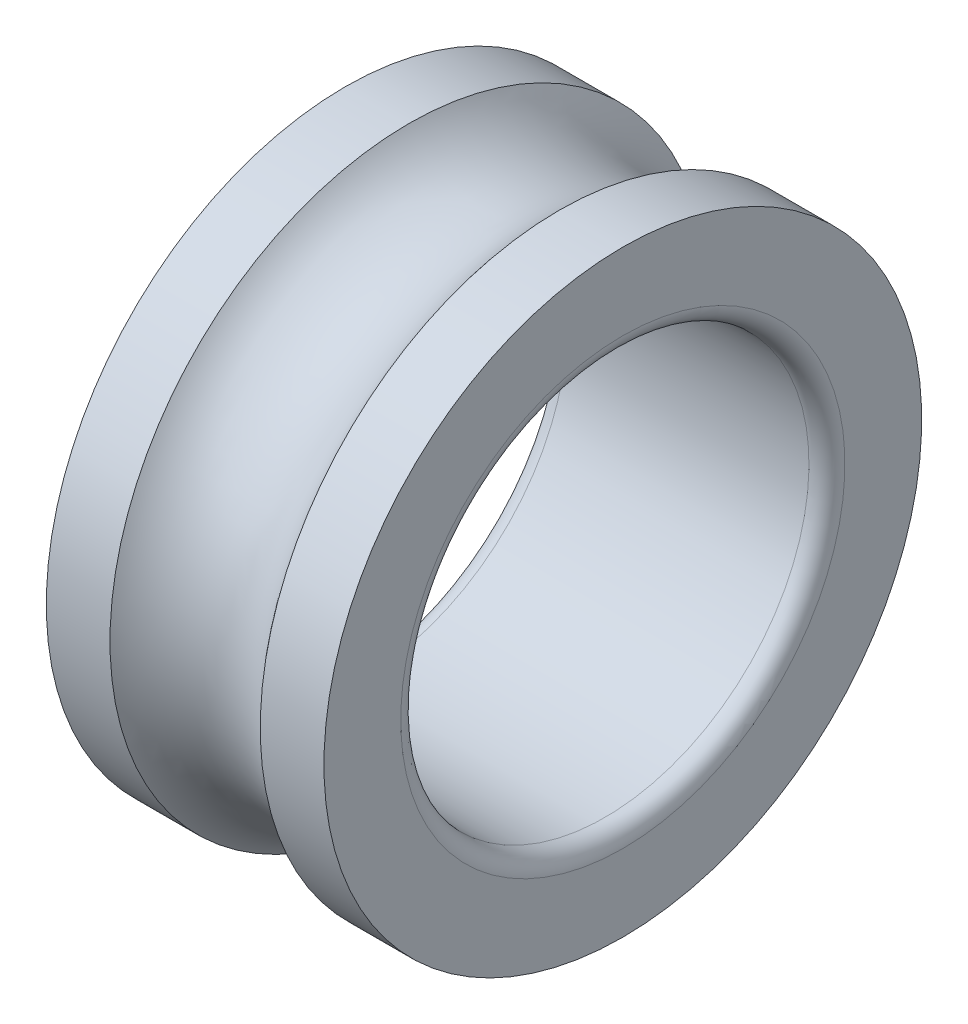
ISO-10303-21;
HEADER;
FILE_DESCRIPTION(('STEP AP214'),'2;1');
FILE_NAME('part.step','',(''),(''),'','','');
FILE_SCHEMA(('AUTOMOTIVE_DESIGN { 1 0 10303 214 1 1 1 1 }'));
ENDSEC;
DATA;
#1=APPLICATION_CONTEXT('core data for automotive mechanical design processes');
#2=APPLICATION_PROTOCOL_DEFINITION('international standard','automotive_design',2000,#1);
#3=PRODUCT_CONTEXT('',#1,'mechanical');
#4=PRODUCT('Part','Part','',(#3));
#5=PRODUCT_RELATED_PRODUCT_CATEGORY('part','',(#4));
#6=PRODUCT_DEFINITION_FORMATION('','',#4);
#7=PRODUCT_DEFINITION_CONTEXT('part definition',#1,'design');
#8=PRODUCT_DEFINITION('design','',#6,#7);
#9=PRODUCT_DEFINITION_SHAPE('','',#8);
#10=(LENGTH_UNIT() NAMED_UNIT(*) SI_UNIT(.MILLI.,.METRE.));
#11=(NAMED_UNIT(*) PLANE_ANGLE_UNIT() SI_UNIT($,.RADIAN.));
#12=(NAMED_UNIT(*) SI_UNIT($,.STERADIAN.) SOLID_ANGLE_UNIT());
#13=UNCERTAINTY_MEASURE_WITH_UNIT(LENGTH_MEASURE(1.E-05),#10,'distance_accuracy_value','');
#14=(GEOMETRIC_REPRESENTATION_CONTEXT(3) GLOBAL_UNCERTAINTY_ASSIGNED_CONTEXT((#13)) GLOBAL_UNIT_ASSIGNED_CONTEXT((#10,
#11,#12)) REPRESENTATION_CONTEXT('',''));
#15=CARTESIAN_POINT('',(0.,0.,0.));
#16=DIRECTION('',(0.,0.,1.));
#17=DIRECTION('',(1.,0.,0.));
#18=AXIS2_PLACEMENT_3D('',#15,#16,#17);
#19=CARTESIAN_POINT('',(15.05,0.,0.));
#20=DIRECTION('',(-1.,0.,0.));
#21=DIRECTION('',(0.,1.,0.));
#22=AXIS2_PLACEMENT_3D('',#19,#20,#21);
#23=CYLINDRICAL_SURFACE('',#22,18.3);
#24=CARTESIAN_POINT('',(13.1,0.,0.));
#25=DIRECTION('',(1.,0.,0.));
#26=DIRECTION('',(0.,1.,0.));
#27=AXIS2_PLACEMENT_3D('',#24,#25,#26);
#28=CIRCLE('',#27,18.3);
#29=CARTESIAN_POINT('',(13.1,18.3,0.));
#30=VERTEX_POINT('',#29);
#31=EDGE_CURVE('E11',#30,#30,#28,.T.);
#32=ORIENTED_EDGE('',*,*,#31,.T.);
#33=EDGE_LOOP('',(#32));
#34=FACE_BOUND('',#33,.T.);
#35=CARTESIAN_POINT('',(17.,0.,0.));
#36=DIRECTION('',(1.,0.,0.));
#37=DIRECTION('',(0.,1.,0.));
#38=AXIS2_PLACEMENT_3D('',#35,#36,#37);
#39=CIRCLE('',#38,18.3);
#40=CARTESIAN_POINT('',(17.,18.3,0.));
#41=VERTEX_POINT('',#40);
#42=EDGE_CURVE('E60',#41,#41,#39,.T.);
#43=ORIENTED_EDGE('',*,*,#42,.F.);
#44=EDGE_LOOP('',(#43));
#45=FACE_BOUND('',#44,.T.);
#46=ADVANCED_FACE('F17',(#34,#45),#23,.T.);
#47=CARTESIAN_POINT('',(8.5,0.,0.));
#48=DIRECTION('',(1.,0.,0.));
#49=DIRECTION('',(0.,0.,-1.));
#50=AXIS2_PLACEMENT_3D('',#47,#48,#49);
#51=TOROIDAL_SURFACE('',#50,21.75,5.75);
#52=CARTESIAN_POINT('',(3.9,0.,0.));
#53=DIRECTION('',(1.,0.,0.));
#54=DIRECTION('',(0.,1.,0.));
#55=AXIS2_PLACEMENT_3D('',#52,#53,#54);
#56=CIRCLE('',#55,18.3);
#57=CARTESIAN_POINT('',(3.9,18.3,0.));
#58=VERTEX_POINT('',#57);
#59=EDGE_CURVE('E28',#58,#58,#56,.T.);
#60=ORIENTED_EDGE('',*,*,#59,.T.);
#61=EDGE_LOOP('',(#60));
#62=FACE_BOUND('',#61,.T.);
#63=ORIENTED_EDGE('',*,*,#31,.F.);
#64=EDGE_LOOP('',(#63));
#65=FACE_BOUND('',#64,.T.);
#66=ADVANCED_FACE('F109',(#62,#65),#51,.F.);
#67=CARTESIAN_POINT('',(1.95,0.,0.));
#68=DIRECTION('',(-1.,0.,0.));
#69=DIRECTION('',(0.,1.,0.));
#70=AXIS2_PLACEMENT_3D('',#67,#68,#69);
#71=CYLINDRICAL_SURFACE('',#70,18.3);
#72=CARTESIAN_POINT('',(0.,0.,0.));
#73=DIRECTION('',(1.,0.,0.));
#74=DIRECTION('',(0.,1.,0.));
#75=AXIS2_PLACEMENT_3D('',#72,#73,#74);
#76=CIRCLE('',#75,18.3);
#77=CARTESIAN_POINT('',(0.,18.3,0.));
#78=VERTEX_POINT('',#77);
#79=EDGE_CURVE('E71',#78,#78,#76,.T.);
#80=ORIENTED_EDGE('',*,*,#79,.T.);
#81=EDGE_LOOP('',(#80));
#82=FACE_BOUND('',#81,.T.);
#83=ORIENTED_EDGE('',*,*,#59,.F.);
#84=EDGE_LOOP('',(#83));
#85=FACE_BOUND('',#84,.T.);
#86=ADVANCED_FACE('F72',(#82,#85),#71,.T.);
#87=CARTESIAN_POINT('',(0.,15.95,0.));
#88=DIRECTION('',(-1.,0.,0.));
#89=DIRECTION('',(0.,-1.,0.));
#90=AXIS2_PLACEMENT_3D('',#87,#88,#89);
#91=PLANE('',#90);
#92=CARTESIAN_POINT('',(0.,0.,0.));
#93=DIRECTION('',(1.,0.,0.));
#94=DIRECTION('',(0.,1.,0.));
#95=AXIS2_PLACEMENT_3D('',#92,#93,#94);
#96=CIRCLE('',#95,13.6);
#97=CARTESIAN_POINT('',(0.,13.6,0.));
#98=VERTEX_POINT('',#97);
#99=EDGE_CURVE('E21',#98,#98,#96,.T.);
#100=ORIENTED_EDGE('',*,*,#99,.T.);
#101=EDGE_LOOP('',(#100));
#102=FACE_BOUND('',#101,.T.);
#103=ORIENTED_EDGE('',*,*,#79,.F.);
#104=EDGE_LOOP('',(#103));
#105=FACE_BOUND('',#104,.T.);
#106=ADVANCED_FACE('F106',(#102,#105),#91,.T.);
#107=CARTESIAN_POINT('',(1.1,0.,0.));
#108=DIRECTION('',(1.,0.,0.));
#109=DIRECTION('',(0.,0.,-1.));
#110=AXIS2_PLACEMENT_3D('',#107,#108,#109);
#111=TOROIDAL_SURFACE('',#110,13.6,1.1);
#112=CARTESIAN_POINT('',(1.1,0.,0.));
#113=DIRECTION('',(1.,0.,0.));
#114=DIRECTION('',(0.,1.,0.));
#115=AXIS2_PLACEMENT_3D('',#112,#113,#114);
#116=CIRCLE('',#115,12.5);
#117=CARTESIAN_POINT('',(1.1,12.5,0.));
#118=VERTEX_POINT('',#117);
#119=EDGE_CURVE('E81',#118,#118,#116,.T.);
#120=ORIENTED_EDGE('',*,*,#119,.T.);
#121=EDGE_LOOP('',(#120));
#122=FACE_BOUND('',#121,.T.);
#123=ORIENTED_EDGE('',*,*,#99,.F.);
#124=EDGE_LOOP('',(#123));
#125=FACE_BOUND('',#124,.T.);
#126=ADVANCED_FACE('F93',(#122,#125),#111,.T.);
#127=CARTESIAN_POINT('',(8.5,0.,0.));
#128=DIRECTION('',(-1.,0.,0.));
#129=DIRECTION('',(0.,1.,0.));
#130=AXIS2_PLACEMENT_3D('',#127,#128,#129);
#131=CYLINDRICAL_SURFACE('',#130,12.5);
#132=CARTESIAN_POINT('',(15.9,0.,0.));
#133=DIRECTION('',(1.,0.,0.));
#134=DIRECTION('',(0.,1.,0.));
#135=AXIS2_PLACEMENT_3D('',#132,#133,#134);
#136=CIRCLE('',#135,12.5);
#137=CARTESIAN_POINT('',(15.9,12.5,0.));
#138=VERTEX_POINT('',#137);
#139=EDGE_CURVE('E65',#138,#138,#136,.T.);
#140=ORIENTED_EDGE('',*,*,#139,.T.);
#141=EDGE_LOOP('',(#140));
#142=FACE_BOUND('',#141,.T.);
#143=ORIENTED_EDGE('',*,*,#119,.F.);
#144=EDGE_LOOP('',(#143));
#145=FACE_BOUND('',#144,.T.);
#146=ADVANCED_FACE('F96',(#142,#145),#131,.F.);
#147=CARTESIAN_POINT('',(15.9,0.,0.));
#148=DIRECTION('',(1.,0.,0.));
#149=DIRECTION('',(0.,0.,-1.));
#150=AXIS2_PLACEMENT_3D('',#147,#148,#149);
#151=TOROIDAL_SURFACE('',#150,13.6,1.1);
#152=CARTESIAN_POINT('',(17.,0.,0.));
#153=DIRECTION('',(1.,0.,0.));
#154=DIRECTION('',(0.,1.,0.));
#155=AXIS2_PLACEMENT_3D('',#152,#153,#154);
#156=CIRCLE('',#155,13.6);
#157=CARTESIAN_POINT('',(17.,13.6,0.));
#158=VERTEX_POINT('',#157);
#159=EDGE_CURVE('E55',#158,#158,#156,.T.);
#160=ORIENTED_EDGE('',*,*,#159,.T.);
#161=EDGE_LOOP('',(#160));
#162=FACE_BOUND('',#161,.T.);
#163=ORIENTED_EDGE('',*,*,#139,.F.);
#164=EDGE_LOOP('',(#163));
#165=FACE_BOUND('',#164,.T.);
#166=ADVANCED_FACE('F98',(#162,#165),#151,.T.);
#167=CARTESIAN_POINT('',(17.,15.95,0.));
#168=DIRECTION('',(1.,0.,0.));
#169=DIRECTION('',(0.,1.,0.));
#170=AXIS2_PLACEMENT_3D('',#167,#168,#169);
#171=PLANE('',#170);
#172=ORIENTED_EDGE('',*,*,#42,.T.);
#173=EDGE_LOOP('',(#172));
#174=FACE_BOUND('',#173,.T.);
#175=ORIENTED_EDGE('',*,*,#159,.F.);
#176=EDGE_LOOP('',(#175));
#177=FACE_BOUND('',#176,.T.);
#178=ADVANCED_FACE('F19',(#174,#177),#171,.T.);
#179=CLOSED_SHELL('',(#46,#66,#86,#106,#126,#146,#166,#178));
#180=MANIFOLD_SOLID_BREP('B1',#179);
#181=ADVANCED_BREP_SHAPE_REPRESENTATION('',(#18,#180),#14);
#182=SHAPE_DEFINITION_REPRESENTATION(#9,#181);
ENDSEC;
END-ISO-10303-21;
